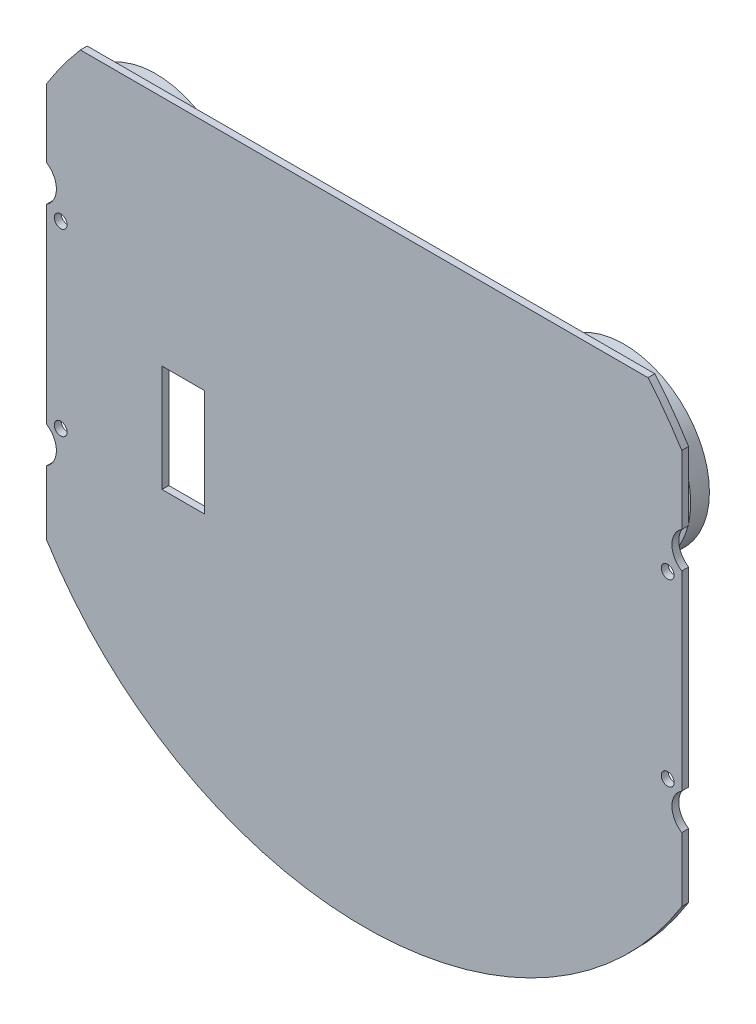
ISO-10303-21;
HEADER;
FILE_DESCRIPTION(('STEP AP214'),'2;1');
FILE_NAME('part.step','',(''),(''),'','','');
FILE_SCHEMA(('AUTOMOTIVE_DESIGN { 1 0 10303 214 1 1 1 1 }'));
ENDSEC;
DATA;
#1=APPLICATION_CONTEXT('core data for automotive mechanical design processes');
#2=APPLICATION_PROTOCOL_DEFINITION('international standard','automotive_design',2000,#1);
#3=PRODUCT_CONTEXT('',#1,'mechanical');
#4=PRODUCT('Part','Part','',(#3));
#5=PRODUCT_RELATED_PRODUCT_CATEGORY('part','',(#4));
#6=PRODUCT_DEFINITION_FORMATION('','',#4);
#7=PRODUCT_DEFINITION_CONTEXT('part definition',#1,'design');
#8=PRODUCT_DEFINITION('design','',#6,#7);
#9=PRODUCT_DEFINITION_SHAPE('','',#8);
#10=(LENGTH_UNIT() NAMED_UNIT(*) SI_UNIT(.MILLI.,.METRE.));
#11=(NAMED_UNIT(*) PLANE_ANGLE_UNIT() SI_UNIT($,.RADIAN.));
#12=(NAMED_UNIT(*) SI_UNIT($,.STERADIAN.) SOLID_ANGLE_UNIT());
#13=UNCERTAINTY_MEASURE_WITH_UNIT(LENGTH_MEASURE(1.E-05),#10,'distance_accuracy_value','');
#14=(GEOMETRIC_REPRESENTATION_CONTEXT(3) GLOBAL_UNCERTAINTY_ASSIGNED_CONTEXT((#13)) GLOBAL_UNIT_ASSIGNED_CONTEXT((#10,
#11,#12)) REPRESENTATION_CONTEXT('',''));
#15=CARTESIAN_POINT('',(0.,0.,0.));
#16=DIRECTION('',(0.,0.,1.));
#17=DIRECTION('',(1.,0.,0.));
#18=AXIS2_PLACEMENT_3D('',#15,#16,#17);
#19=CARTESIAN_POINT('',(-74.3,-100.,10.));
#20=DIRECTION('',(-1.,0.,0.));
#21=DIRECTION('',(0.,0.,1.));
#22=AXIS2_PLACEMENT_3D('',#19,#20,#21);
#23=PLANE('',#22);
#24=DIRECTION('',(0.,0.,-1.));
#25=VECTOR('',#24,1.);
#26=CARTESIAN_POINT('',(-74.3,-22.7916749174998,10.));
#27=LINE('',#26,#25);
#28=CARTESIAN_POINT('',(-74.3,-22.7916749174998,1.6));
#29=VERTEX_POINT('',#28);
#30=CARTESIAN_POINT('',(-74.3,-22.7916749174998,0.));
#31=VERTEX_POINT('',#30);
#32=EDGE_CURVE('E343',#29,#31,#27,.T.);
#33=ORIENTED_EDGE('',*,*,#32,.F.);
#34=DIRECTION('',(0.,-1.,0.));
#35=VECTOR('',#34,1.);
#36=CARTESIAN_POINT('',(-74.3,0.,1.6));
#37=LINE('',#36,#35);
#38=CARTESIAN_POINT('',(-74.3,21.7916749174998,1.6));
#39=VERTEX_POINT('',#38);
#40=EDGE_CURVE('E258',#39,#29,#37,.T.);
#41=ORIENTED_EDGE('',*,*,#40,.F.);
#42=DIRECTION('',(0.,0.,-1.));
#43=VECTOR('',#42,1.);
#44=CARTESIAN_POINT('',(-74.3,21.7916749174998,10.));
#45=LINE('',#44,#43);
#46=CARTESIAN_POINT('',(-74.3,21.7916749174999,0.));
#47=VERTEX_POINT('',#46);
#48=EDGE_CURVE('E337',#47,#39,#45,.F.);
#49=ORIENTED_EDGE('',*,*,#48,.F.);
#50=DIRECTION('',(0.,1.,0.));
#51=VECTOR('',#50,1.);
#52=CARTESIAN_POINT('',(-74.3,-100.,0.));
#53=LINE('',#52,#51);
#54=EDGE_CURVE('E252',#31,#47,#53,.T.);
#55=ORIENTED_EDGE('',*,*,#54,.F.);
#56=EDGE_LOOP('',(#33,#41,#49,#55));
#57=FACE_BOUND('',#56,.T.);
#58=ADVANCED_FACE('F38',(#57),#23,.T.);
#59=CARTESIAN_POINT('',(0.,0.,0.));
#60=DIRECTION('',(0.,0.,1.));
#61=DIRECTION('',(1.,0.,0.));
#62=AXIS2_PLACEMENT_3D('',#59,#60,#61);
#63=PLANE('',#62);
#64=CARTESIAN_POINT('',(-54.772,35.,0.));
#65=DIRECTION('',(0.,0.,1.));
#66=DIRECTION('',(1.,0.,0.));
#67=AXIS2_PLACEMENT_3D('',#64,#65,#66);
#68=CIRCLE('',#67,20.);
#69=CARTESIAN_POINT('',(-74.3,30.6806000416723,0.));
#70=VERTEX_POINT('',#69);
#71=CARTESIAN_POINT('',(-74.1675995107123,30.1203771026792,0.));
#72=VERTEX_POINT('',#71);
#73=EDGE_CURVE('E298',#70,#72,#68,.T.);
#74=ORIENTED_EDGE('',*,*,#73,.T.);
#75=CARTESIAN_POINT('',(-77.,26.,0.));
#76=DIRECTION('',(0.,0.,-1.));
#77=DIRECTION('',(-1.,0.,0.));
#78=AXIS2_PLACEMENT_3D('',#75,#76,#77);
#79=CIRCLE('',#78,5.);
#80=CARTESIAN_POINT('',(-74.3,30.2083250825002,0.));
#81=VERTEX_POINT('',#80);
#82=EDGE_CURVE('E220',#81,#72,#79,.T.);
#83=ORIENTED_EDGE('',*,*,#82,.F.);
#84=EDGE_CURVE('E409',#81,#70,#53,.T.);
#85=ORIENTED_EDGE('',*,*,#84,.T.);
#86=EDGE_LOOP('',(#74,#83,#85));
#87=FACE_BOUND('',#86,.T.);
#88=ADVANCED_FACE('F368',(#87),#63,.F.);
#89=DIRECTION('',(0.,0.,-1.));
#90=VECTOR('',#89,1.);
#91=CARTESIAN_POINT('',(-74.3,30.2083250825002,10.));
#92=LINE('',#91,#90);
#93=CARTESIAN_POINT('',(-74.3,30.2083250825002,1.6));
#94=VERTEX_POINT('',#93);
#95=EDGE_CURVE('E339',#94,#81,#92,.T.);
#96=ORIENTED_EDGE('',*,*,#95,.F.);
#97=CARTESIAN_POINT('',(-74.3,46.2142835062928,1.6));
#98=VERTEX_POINT('',#97);
#99=EDGE_CURVE('E254',#98,#94,#37,.T.);
#100=ORIENTED_EDGE('',*,*,#99,.F.);
#101=DIRECTION('',(0.,0.,-1.));
#102=VECTOR('',#101,1.);
#103=CARTESIAN_POINT('',(-74.3,46.2142835062928,1.6));
#104=LINE('',#103,#102);
#105=CARTESIAN_POINT('',(-74.3,46.2142835062928,0.));
#106=VERTEX_POINT('',#105);
#107=EDGE_CURVE('E321',#98,#106,#104,.T.);
#108=ORIENTED_EDGE('',*,*,#107,.T.);
#109=CARTESIAN_POINT('',(-74.3,39.3193999583277,0.));
#110=VERTEX_POINT('',#109);
#111=EDGE_CURVE('E248',#110,#106,#53,.T.);
#112=ORIENTED_EDGE('',*,*,#111,.F.);
#113=EDGE_CURVE('E251',#70,#110,#53,.T.);
#114=ORIENTED_EDGE('',*,*,#113,.F.);
#115=ORIENTED_EDGE('',*,*,#84,.F.);
#116=EDGE_LOOP('',(#96,#100,#108,#112,#114,#115));
#117=FACE_BOUND('',#116,.T.);
#118=ADVANCED_FACE('F371',(#117),#23,.T.);
#119=DIRECTION('',(0.,-1.,0.));
#120=VECTOR('',#119,1.);
#121=CARTESIAN_POINT('',(74.3,-100.,0.));
#122=LINE('',#121,#120);
#123=CARTESIAN_POINT('',(74.3,30.6806000416725,0.));
#124=VERTEX_POINT('',#123);
#125=CARTESIAN_POINT('',(74.3,30.2083250825002,0.));
#126=VERTEX_POINT('',#125);
#127=EDGE_CURVE('E242',#124,#126,#122,.T.);
#128=ORIENTED_EDGE('',*,*,#127,.T.);
#129=CARTESIAN_POINT('',(77.,26.,0.));
#130=DIRECTION('',(0.,0.,-1.));
#131=DIRECTION('',(-1.,0.,0.));
#132=AXIS2_PLACEMENT_3D('',#129,#130,#131);
#133=CIRCLE('',#132,5.);
#134=CARTESIAN_POINT('',(74.1675995107123,30.1203771026792,0.));
#135=VERTEX_POINT('',#134);
#136=EDGE_CURVE('E229',#135,#126,#133,.T.);
#137=ORIENTED_EDGE('',*,*,#136,.F.);
#138=CARTESIAN_POINT('',(54.772,35.,0.));
#139=DIRECTION('',(0.,0.,1.));
#140=DIRECTION('',(1.,0.,0.));
#141=AXIS2_PLACEMENT_3D('',#138,#139,#140);
#142=CIRCLE('',#141,20.);
#143=EDGE_CURVE('E284',#135,#124,#142,.T.);
#144=ORIENTED_EDGE('',*,*,#143,.T.);
#145=EDGE_LOOP('',(#128,#137,#144));
#146=FACE_BOUND('',#145,.T.);
#147=ADVANCED_FACE('F378',(#146),#63,.F.);
#148=CARTESIAN_POINT('',(74.3,-100.,10.));
#149=DIRECTION('',(1.,0.,0.));
#150=DIRECTION('',(0.,0.,-1.));
#151=AXIS2_PLACEMENT_3D('',#148,#149,#150);
#152=PLANE('',#151);
#153=DIRECTION('',(0.,0.,-1.));
#154=VECTOR('',#153,1.);
#155=CARTESIAN_POINT('',(74.3,21.7916749174998,10.));
#156=LINE('',#155,#154);
#157=CARTESIAN_POINT('',(74.3,21.7916749174998,1.6));
#158=VERTEX_POINT('',#157);
#159=CARTESIAN_POINT('',(74.3,21.7916749174998,0.));
#160=VERTEX_POINT('',#159);
#161=EDGE_CURVE('E335',#158,#160,#156,.T.);
#162=ORIENTED_EDGE('',*,*,#161,.F.);
#163=DIRECTION('',(0.,1.,0.));
#164=VECTOR('',#163,1.);
#165=CARTESIAN_POINT('',(74.3,0.,1.6));
#166=LINE('',#165,#164);
#167=CARTESIAN_POINT('',(74.3,-22.7916749174998,1.6));
#168=VERTEX_POINT('',#167);
#169=EDGE_CURVE('E264',#168,#158,#166,.T.);
#170=ORIENTED_EDGE('',*,*,#169,.F.);
#171=DIRECTION('',(0.,0.,-1.));
#172=VECTOR('',#171,1.);
#173=CARTESIAN_POINT('',(74.3,-22.7916749174998,10.));
#174=LINE('',#173,#172);
#175=CARTESIAN_POINT('',(74.3,-22.7916749174998,0.));
#176=VERTEX_POINT('',#175);
#177=EDGE_CURVE('E329',#176,#168,#174,.F.);
#178=ORIENTED_EDGE('',*,*,#177,.F.);
#179=EDGE_CURVE('E246',#160,#176,#122,.T.);
#180=ORIENTED_EDGE('',*,*,#179,.F.);
#181=EDGE_LOOP('',(#162,#170,#178,#180));
#182=FACE_BOUND('',#181,.T.);
#183=ADVANCED_FACE('F397',(#182),#152,.T.);
#184=DIRECTION('',(0.,0.,-1.));
#185=VECTOR('',#184,1.);
#186=CARTESIAN_POINT('',(74.3,-31.2083250825001,10.));
#187=LINE('',#186,#185);
#188=CARTESIAN_POINT('',(74.3,-31.2083250825001,1.6));
#189=VERTEX_POINT('',#188);
#190=CARTESIAN_POINT('',(74.3,-31.2083250825001,0.));
#191=VERTEX_POINT('',#190);
#192=EDGE_CURVE('E331',#189,#191,#187,.T.);
#193=ORIENTED_EDGE('',*,*,#192,.F.);
#194=CARTESIAN_POINT('',(74.3,-46.2142835062927,1.6));
#195=VERTEX_POINT('',#194);
#196=EDGE_CURVE('E260',#195,#189,#166,.T.);
#197=ORIENTED_EDGE('',*,*,#196,.F.);
#198=DIRECTION('',(0.,0.,-1.));
#199=VECTOR('',#198,1.);
#200=CARTESIAN_POINT('',(74.3,-46.2142835062927,1.6));
#201=LINE('',#200,#199);
#202=CARTESIAN_POINT('',(74.3,-46.2142835062927,0.));
#203=VERTEX_POINT('',#202);
#204=EDGE_CURVE('E326',#195,#203,#201,.T.);
#205=ORIENTED_EDGE('',*,*,#204,.T.);
#206=EDGE_CURVE('E241',#191,#203,#122,.T.);
#207=ORIENTED_EDGE('',*,*,#206,.F.);
#208=EDGE_LOOP('',(#193,#197,#205,#207));
#209=FACE_BOUND('',#208,.T.);
#210=ADVANCED_FACE('F398',(#209),#152,.T.);
#211=CARTESIAN_POINT('',(0.,0.,1.6));
#212=DIRECTION('',(0.,0.,1.));
#213=DIRECTION('',(1.,0.,0.));
#214=AXIS2_PLACEMENT_3D('',#211,#212,#213);
#215=PLANE('',#214);
#216=CARTESIAN_POINT('',(-71.,-22.,1.6));
#217=DIRECTION('',(0.,0.,-1.));
#218=DIRECTION('',(-1.,0.,0.));
#219=AXIS2_PLACEMENT_3D('',#216,#217,#218);
#220=CIRCLE('',#219,1.5);
#221=CARTESIAN_POINT('',(-72.5,-22.,1.6));
#222=VERTEX_POINT('',#221);
#223=EDGE_CURVE('E754',#222,#222,#220,.T.);
#224=ORIENTED_EDGE('',*,*,#223,.T.);
#225=EDGE_LOOP('',(#224));
#226=FACE_BOUND('',#225,.T.);
#227=CARTESIAN_POINT('',(-71.,20.,1.6));
#228=DIRECTION('',(0.,0.,-1.));
#229=DIRECTION('',(-1.,0.,0.));
#230=AXIS2_PLACEMENT_3D('',#227,#228,#229);
#231=CIRCLE('',#230,1.5);
#232=CARTESIAN_POINT('',(-72.5,20.,1.6));
#233=VERTEX_POINT('',#232);
#234=EDGE_CURVE('E762',#233,#233,#231,.T.);
#235=ORIENTED_EDGE('',*,*,#234,.T.);
#236=EDGE_LOOP('',(#235));
#237=FACE_BOUND('',#236,.T.);
#238=CARTESIAN_POINT('',(71.,-22.,1.6));
#239=DIRECTION('',(0.,0.,-1.));
#240=DIRECTION('',(-1.,0.,0.));
#241=AXIS2_PLACEMENT_3D('',#238,#239,#240);
#242=CIRCLE('',#241,1.5);
#243=CARTESIAN_POINT('',(69.5,-22.,1.6));
#244=VERTEX_POINT('',#243);
#245=EDGE_CURVE('E768',#244,#244,#242,.T.);
#246=ORIENTED_EDGE('',*,*,#245,.T.);
#247=EDGE_LOOP('',(#246));
#248=FACE_BOUND('',#247,.T.);
#249=CARTESIAN_POINT('',(71.,20.,1.6));
#250=DIRECTION('',(0.,0.,-1.));
#251=DIRECTION('',(-1.,0.,0.));
#252=AXIS2_PLACEMENT_3D('',#249,#250,#251);
#253=CIRCLE('',#252,1.5);
#254=CARTESIAN_POINT('',(69.5,20.,1.6));
#255=VERTEX_POINT('',#254);
#256=EDGE_CURVE('E774',#255,#255,#253,.T.);
#257=ORIENTED_EDGE('',*,*,#256,.T.);
#258=EDGE_LOOP('',(#257));
#259=FACE_BOUND('',#258,.T.);
#260=DIRECTION('',(0.,1.,0.));
#261=VECTOR('',#260,1.);
#262=CARTESIAN_POINT('',(-37.3,-22.5,1.6));
#263=LINE('',#262,#261);
#264=CARTESIAN_POINT('',(-37.3,-22.5,1.6));
#265=VERTEX_POINT('',#264);
#266=CARTESIAN_POINT('',(-37.3,2.50000000000001,1.6));
#267=VERTEX_POINT('',#266);
#268=EDGE_CURVE('E53',#265,#267,#263,.T.);
#269=ORIENTED_EDGE('',*,*,#268,.F.);
#270=DIRECTION('',(1.,0.,0.));
#271=VECTOR('',#270,1.);
#272=CARTESIAN_POINT('',(-47.3,-22.5,1.6));
#273=LINE('',#272,#271);
#274=CARTESIAN_POINT('',(-47.3,-22.5,1.6));
#275=VERTEX_POINT('',#274);
#276=EDGE_CURVE('E206',#275,#265,#273,.T.);
#277=ORIENTED_EDGE('',*,*,#276,.F.);
#278=DIRECTION('',(0.,-1.,0.));
#279=VECTOR('',#278,1.);
#280=CARTESIAN_POINT('',(-47.3,-22.5,1.6));
#281=LINE('',#280,#279);
#282=CARTESIAN_POINT('',(-47.3,2.50000000000001,1.6));
#283=VERTEX_POINT('',#282);
#284=EDGE_CURVE('E190',#283,#275,#281,.T.);
#285=ORIENTED_EDGE('',*,*,#284,.F.);
#286=DIRECTION('',(-1.,0.,0.));
#287=VECTOR('',#286,1.);
#288=CARTESIAN_POINT('',(-47.3,2.50000000000001,1.6));
#289=LINE('',#288,#287);
#290=EDGE_CURVE('E199',#267,#283,#289,.T.);
#291=ORIENTED_EDGE('',*,*,#290,.F.);
#292=EDGE_LOOP('',(#269,#277,#285,#291));
#293=FACE_BOUND('',#292,.T.);
#294=CARTESIAN_POINT('',(-77.,-27.,1.6));
#295=DIRECTION('',(0.,0.,1.));
#296=DIRECTION('',(1.,0.,0.));
#297=AXIS2_PLACEMENT_3D('',#294,#295,#296);
#298=CIRCLE('',#297,5.);
#299=CARTESIAN_POINT('',(-74.3,-31.2083250825002,1.6));
#300=VERTEX_POINT('',#299);
#301=EDGE_CURVE('E217',#300,#29,#298,.T.);
#302=ORIENTED_EDGE('',*,*,#301,.F.);
#303=CARTESIAN_POINT('',(-74.3,-46.2142835062928,1.6));
#304=VERTEX_POINT('',#303);
#305=EDGE_CURVE('E259',#300,#304,#37,.T.);
#306=ORIENTED_EDGE('',*,*,#305,.T.);
#307=CARTESIAN_POINT('',(0.,0.,1.6));
#308=DIRECTION('',(0.,0.,1.));
#309=DIRECTION('',(1.,0.,0.));
#310=AXIS2_PLACEMENT_3D('',#307,#308,#309);
#311=CIRCLE('',#310,87.5);
#312=EDGE_CURVE('E303',#304,#195,#311,.T.);
#313=ORIENTED_EDGE('',*,*,#312,.T.);
#314=ORIENTED_EDGE('',*,*,#196,.T.);
#315=CARTESIAN_POINT('',(77.,-27.,1.6));
#316=DIRECTION('',(0.,0.,1.));
#317=DIRECTION('',(1.,0.,0.));
#318=AXIS2_PLACEMENT_3D('',#315,#316,#317);
#319=CIRCLE('',#318,5.);
#320=EDGE_CURVE('E239',#168,#189,#319,.T.);
#321=ORIENTED_EDGE('',*,*,#320,.F.);
#322=ORIENTED_EDGE('',*,*,#169,.T.);
#323=CARTESIAN_POINT('',(77.,26.,1.6));
#324=DIRECTION('',(0.,0.,1.));
#325=DIRECTION('',(1.,0.,0.));
#326=AXIS2_PLACEMENT_3D('',#323,#324,#325);
#327=CIRCLE('',#326,5.);
#328=CARTESIAN_POINT('',(74.3,30.2083250825002,1.6));
#329=VERTEX_POINT('',#328);
#330=EDGE_CURVE('E234',#329,#158,#327,.T.);
#331=ORIENTED_EDGE('',*,*,#330,.F.);
#332=CARTESIAN_POINT('',(74.3,46.2142835062927,1.6));
#333=VERTEX_POINT('',#332);
#334=EDGE_CURVE('E257',#329,#333,#166,.T.);
#335=ORIENTED_EDGE('',*,*,#334,.T.);
#336=CARTESIAN_POINT('',(66.3871222452066,57.,1.6));
#337=VERTEX_POINT('',#336);
#338=EDGE_CURVE('E304',#333,#337,#311,.T.);
#339=ORIENTED_EDGE('',*,*,#338,.T.);
#340=DIRECTION('',(-1.,0.,0.));
#341=VECTOR('',#340,1.);
#342=CARTESIAN_POINT('',(-66.3871222452066,57.,1.6));
#343=LINE('',#342,#341);
#344=CARTESIAN_POINT('',(-66.3871222452066,57.,1.6));
#345=VERTEX_POINT('',#344);
#346=EDGE_CURVE('E302',#337,#345,#343,.T.);
#347=ORIENTED_EDGE('',*,*,#346,.T.);
#348=EDGE_CURVE('E299',#345,#98,#311,.T.);
#349=ORIENTED_EDGE('',*,*,#348,.T.);
#350=ORIENTED_EDGE('',*,*,#99,.T.);
#351=CARTESIAN_POINT('',(-77.,26.,1.6));
#352=DIRECTION('',(0.,0.,1.));
#353=DIRECTION('',(1.,0.,0.));
#354=AXIS2_PLACEMENT_3D('',#351,#352,#353);
#355=CIRCLE('',#354,5.);
#356=EDGE_CURVE('E226',#39,#94,#355,.T.);
#357=ORIENTED_EDGE('',*,*,#356,.F.);
#358=ORIENTED_EDGE('',*,*,#40,.T.);
#359=EDGE_LOOP('',(#302,#306,#313,#314,#321,#322,#331,#335,#339,#347,#349,#350,#357,#358));
#360=FACE_BOUND('',#359,.T.);
#361=ADVANCED_FACE('F203',(#226,#237,#248,#259,#293,#360),#215,.T.);
#362=CARTESIAN_POINT('',(-71.,-22.,0.));
#363=DIRECTION('',(0.,0.,-1.));
#364=DIRECTION('',(-1.,0.,0.));
#365=AXIS2_PLACEMENT_3D('',#362,#363,#364);
#366=CIRCLE('',#365,1.5);
#367=CARTESIAN_POINT('',(-72.5,-22.,0.));
#368=VERTEX_POINT('',#367);
#369=EDGE_CURVE('E757',#368,#368,#366,.T.);
#370=ORIENTED_EDGE('',*,*,#369,.F.);
#371=EDGE_LOOP('',(#370));
#372=FACE_BOUND('',#371,.T.);
#373=CARTESIAN_POINT('',(-71.,20.,0.));
#374=DIRECTION('',(0.,0.,-1.));
#375=DIRECTION('',(-1.,0.,0.));
#376=AXIS2_PLACEMENT_3D('',#373,#374,#375);
#377=CIRCLE('',#376,1.5);
#378=CARTESIAN_POINT('',(-72.5,20.,0.));
#379=VERTEX_POINT('',#378);
#380=EDGE_CURVE('E759',#379,#379,#377,.T.);
#381=ORIENTED_EDGE('',*,*,#380,.F.);
#382=EDGE_LOOP('',(#381));
#383=FACE_BOUND('',#382,.T.);
#384=CARTESIAN_POINT('',(71.,-22.,0.));
#385=DIRECTION('',(0.,0.,-1.));
#386=DIRECTION('',(-1.,0.,0.));
#387=AXIS2_PLACEMENT_3D('',#384,#385,#386);
#388=CIRCLE('',#387,1.5);
#389=CARTESIAN_POINT('',(69.5,-22.,0.));
#390=VERTEX_POINT('',#389);
#391=EDGE_CURVE('E765',#390,#390,#388,.T.);
#392=ORIENTED_EDGE('',*,*,#391,.F.);
#393=EDGE_LOOP('',(#392));
#394=FACE_BOUND('',#393,.T.);
#395=CARTESIAN_POINT('',(71.,20.,0.));
#396=DIRECTION('',(0.,0.,-1.));
#397=DIRECTION('',(-1.,0.,0.));
#398=AXIS2_PLACEMENT_3D('',#395,#396,#397);
#399=CIRCLE('',#398,1.5);
#400=CARTESIAN_POINT('',(69.5,20.,0.));
#401=VERTEX_POINT('',#400);
#402=EDGE_CURVE('E771',#401,#401,#399,.T.);
#403=ORIENTED_EDGE('',*,*,#402,.F.);
#404=EDGE_LOOP('',(#403));
#405=FACE_BOUND('',#404,.T.);
#406=DIRECTION('',(1.,0.,0.));
#407=VECTOR('',#406,1.);
#408=CARTESIAN_POINT('',(0.,-22.5,0.));
#409=LINE('',#408,#407);
#410=CARTESIAN_POINT('',(-47.3,-22.5,0.));
#411=VERTEX_POINT('',#410);
#412=CARTESIAN_POINT('',(-37.3,-22.5,0.));
#413=VERTEX_POINT('',#412);
#414=EDGE_CURVE('E46',#411,#413,#409,.T.);
#415=ORIENTED_EDGE('',*,*,#414,.T.);
#416=DIRECTION('',(0.,1.,0.));
#417=VECTOR('',#416,1.);
#418=CARTESIAN_POINT('',(-37.3,0.,0.));
#419=LINE('',#418,#417);
#420=CARTESIAN_POINT('',(-37.3,2.50000000000001,0.));
#421=VERTEX_POINT('',#420);
#422=EDGE_CURVE('E12',#413,#421,#419,.T.);
#423=ORIENTED_EDGE('',*,*,#422,.T.);
#424=DIRECTION('',(-1.,0.,0.));
#425=VECTOR('',#424,1.);
#426=CARTESIAN_POINT('',(0.,2.50000000000001,0.));
#427=LINE('',#426,#425);
#428=CARTESIAN_POINT('',(-47.3,2.50000000000001,0.));
#429=VERTEX_POINT('',#428);
#430=EDGE_CURVE('E345',#421,#429,#427,.T.);
#431=ORIENTED_EDGE('',*,*,#430,.T.);
#432=DIRECTION('',(0.,-1.,0.));
#433=VECTOR('',#432,1.);
#434=CARTESIAN_POINT('',(-47.3,0.,0.));
#435=LINE('',#434,#433);
#436=EDGE_CURVE('E193',#429,#411,#435,.T.);
#437=ORIENTED_EDGE('',*,*,#436,.T.);
#438=EDGE_LOOP('',(#415,#423,#431,#437));
#439=FACE_BOUND('',#438,.T.);
#440=CARTESIAN_POINT('',(35.,-54.772,0.));
#441=DIRECTION('',(0.,0.,1.));
#442=DIRECTION('',(1.,0.,0.));
#443=AXIS2_PLACEMENT_3D('',#440,#441,#442);
#444=CIRCLE('',#443,20.);
#445=CARTESIAN_POINT('',(55.,-54.772,0.));
#446=VERTEX_POINT('',#445);
#447=EDGE_CURVE('E267',#446,#446,#444,.T.);
#448=ORIENTED_EDGE('',*,*,#447,.T.);
#449=EDGE_LOOP('',(#448));
#450=FACE_BOUND('',#449,.T.);
#451=CARTESIAN_POINT('',(0.,0.,0.));
#452=DIRECTION('',(0.,0.,1.));
#453=DIRECTION('',(1.,0.,0.));
#454=AXIS2_PLACEMENT_3D('',#451,#452,#453);
#455=CIRCLE('',#454,25.);
#456=CARTESIAN_POINT('',(25.,0.,0.));
#457=VERTEX_POINT('',#456);
#458=EDGE_CURVE('E287',#457,#457,#455,.T.);
#459=ORIENTED_EDGE('',*,*,#458,.T.);
#460=EDGE_LOOP('',(#459));
#461=FACE_BOUND('',#460,.T.);
#462=CARTESIAN_POINT('',(-35.,-54.772,0.));
#463=DIRECTION('',(0.,0.,1.));
#464=DIRECTION('',(1.,0.,0.));
#465=AXIS2_PLACEMENT_3D('',#462,#463,#464);
#466=CIRCLE('',#465,20.);
#467=CARTESIAN_POINT('',(-15.,-54.772,0.));
#468=VERTEX_POINT('',#467);
#469=EDGE_CURVE('E273',#468,#468,#466,.T.);
#470=ORIENTED_EDGE('',*,*,#469,.T.);
#471=EDGE_LOOP('',(#470));
#472=FACE_BOUND('',#471,.T.);
#473=CARTESIAN_POINT('',(-74.3,-46.2142835062928,0.));
#474=VERTEX_POINT('',#473);
#475=CARTESIAN_POINT('',(-74.3,-31.2083250825002,0.));
#476=VERTEX_POINT('',#475);
#477=EDGE_CURVE('E253',#474,#476,#53,.T.);
#478=ORIENTED_EDGE('',*,*,#477,.T.);
#479=CARTESIAN_POINT('',(-77.,-27.,0.));
#480=DIRECTION('',(0.,0.,-1.));
#481=DIRECTION('',(-1.,0.,0.));
#482=AXIS2_PLACEMENT_3D('',#479,#480,#481);
#483=CIRCLE('',#482,5.);
#484=EDGE_CURVE('E213',#31,#476,#483,.T.);
#485=ORIENTED_EDGE('',*,*,#484,.F.);
#486=ORIENTED_EDGE('',*,*,#54,.T.);
#487=CARTESIAN_POINT('',(-72.0988051882717,25.0109148583225,0.));
#488=VERTEX_POINT('',#487);
#489=EDGE_CURVE('E219',#488,#47,#79,.T.);
#490=ORIENTED_EDGE('',*,*,#489,.F.);
#491=EDGE_CURVE('E293',#488,#110,#68,.T.);
#492=ORIENTED_EDGE('',*,*,#491,.T.);
#493=ORIENTED_EDGE('',*,*,#111,.T.);
#494=CARTESIAN_POINT('',(0.,0.,0.));
#495=DIRECTION('',(0.,0.,1.));
#496=DIRECTION('',(1.,0.,0.));
#497=AXIS2_PLACEMENT_3D('',#494,#495,#496);
#498=CIRCLE('',#497,87.5);
#499=CARTESIAN_POINT('',(-66.3871222452066,57.,0.));
#500=VERTEX_POINT('',#499);
#501=EDGE_CURVE('E307',#500,#106,#498,.T.);
#502=ORIENTED_EDGE('',*,*,#501,.F.);
#503=DIRECTION('',(-1.,0.,0.));
#504=VECTOR('',#503,1.);
#505=CARTESIAN_POINT('',(-66.3871222452066,57.,0.));
#506=LINE('',#505,#504);
#507=CARTESIAN_POINT('',(66.3871222452066,57.,0.));
#508=VERTEX_POINT('',#507);
#509=EDGE_CURVE('E310',#508,#500,#506,.T.);
#510=ORIENTED_EDGE('',*,*,#509,.F.);
#511=CARTESIAN_POINT('',(74.3,46.2142835062927,0.));
#512=VERTEX_POINT('',#511);
#513=EDGE_CURVE('E297',#512,#508,#498,.T.);
#514=ORIENTED_EDGE('',*,*,#513,.F.);
#515=CARTESIAN_POINT('',(74.3,39.3193999583275,0.));
#516=VERTEX_POINT('',#515);
#517=EDGE_CURVE('E247',#512,#516,#122,.T.);
#518=ORIENTED_EDGE('',*,*,#517,.T.);
#519=CARTESIAN_POINT('',(72.0988051882717,25.0109148583225,0.));
#520=VERTEX_POINT('',#519);
#521=EDGE_CURVE('E280',#516,#520,#142,.T.);
#522=ORIENTED_EDGE('',*,*,#521,.T.);
#523=EDGE_CURVE('E232',#160,#520,#133,.T.);
#524=ORIENTED_EDGE('',*,*,#523,.F.);
#525=ORIENTED_EDGE('',*,*,#179,.T.);
#526=CARTESIAN_POINT('',(77.,-27.,0.));
#527=DIRECTION('',(0.,0.,-1.));
#528=DIRECTION('',(-1.,0.,0.));
#529=AXIS2_PLACEMENT_3D('',#526,#527,#528);
#530=CIRCLE('',#529,5.);
#531=EDGE_CURVE('E236',#191,#176,#530,.T.);
#532=ORIENTED_EDGE('',*,*,#531,.F.);
#533=ORIENTED_EDGE('',*,*,#206,.T.);
#534=EDGE_CURVE('E311',#474,#203,#498,.T.);
#535=ORIENTED_EDGE('',*,*,#534,.F.);
#536=EDGE_LOOP('',(#478,#485,#486,#490,#492,#493,#502,#510,#514,#518,#522,#524,#525,#532,#533,#535));
#537=FACE_BOUND('',#536,.T.);
#538=ADVANCED_FACE('F349',(#372,#383,#394,#405,#439,#450,#461,#472,#537),#63,.F.);
#539=CARTESIAN_POINT('',(0.,0.,1.6));
#540=DIRECTION('',(0.,0.,-1.));
#541=DIRECTION('',(-1.,0.,0.));
#542=AXIS2_PLACEMENT_3D('',#539,#540,#541);
#543=CYLINDRICAL_SURFACE('',#542,87.5);
#544=ORIENTED_EDGE('',*,*,#204,.F.);
#545=ORIENTED_EDGE('',*,*,#312,.F.);
#546=DIRECTION('',(0.,0.,-1.));
#547=VECTOR('',#546,1.);
#548=CARTESIAN_POINT('',(-74.3,-46.2142835062928,1.6));
#549=LINE('',#548,#547);
#550=EDGE_CURVE('E318',#474,#304,#549,.F.);
#551=ORIENTED_EDGE('',*,*,#550,.F.);
#552=ORIENTED_EDGE('',*,*,#534,.T.);
#553=EDGE_LOOP('',(#544,#545,#551,#552));
#554=FACE_BOUND('',#553,.T.);
#555=ADVANCED_FACE('F40',(#554),#543,.T.);
#556=DIRECTION('',(0.,0.,-1.));
#557=VECTOR('',#556,1.);
#558=CARTESIAN_POINT('',(74.3,46.2142835062927,1.6));
#559=LINE('',#558,#557);
#560=EDGE_CURVE('E323',#512,#333,#559,.F.);
#561=ORIENTED_EDGE('',*,*,#560,.F.);
#562=ORIENTED_EDGE('',*,*,#513,.T.);
#563=DIRECTION('',(0.,0.,-1.));
#564=VECTOR('',#563,1.);
#565=CARTESIAN_POINT('',(66.3871222452066,57.,1.6));
#566=LINE('',#565,#564);
#567=EDGE_CURVE('E315',#337,#508,#566,.T.);
#568=ORIENTED_EDGE('',*,*,#567,.F.);
#569=ORIENTED_EDGE('',*,*,#338,.F.);
#570=EDGE_LOOP('',(#561,#562,#568,#569));
#571=FACE_BOUND('',#570,.T.);
#572=ADVANCED_FACE('F539',(#571),#543,.T.);
#573=ORIENTED_EDGE('',*,*,#107,.F.);
#574=ORIENTED_EDGE('',*,*,#348,.F.);
#575=DIRECTION('',(0.,0.,-1.));
#576=VECTOR('',#575,1.);
#577=CARTESIAN_POINT('',(-66.3871222452066,57.,1.6));
#578=LINE('',#577,#576);
#579=EDGE_CURVE('E306',#345,#500,#578,.T.);
#580=ORIENTED_EDGE('',*,*,#579,.T.);
#581=ORIENTED_EDGE('',*,*,#501,.T.);
#582=EDGE_LOOP('',(#573,#574,#580,#581));
#583=FACE_BOUND('',#582,.T.);
#584=ADVANCED_FACE('F534',(#583),#543,.T.);
#585=CARTESIAN_POINT('',(-66.3871222452066,57.,1.6));
#586=DIRECTION('',(0.,-1.,0.));
#587=DIRECTION('',(0.,0.,-1.));
#588=AXIS2_PLACEMENT_3D('',#585,#586,#587);
#589=PLANE('',#588);
#590=ORIENTED_EDGE('',*,*,#509,.T.);
#591=ORIENTED_EDGE('',*,*,#579,.F.);
#592=ORIENTED_EDGE('',*,*,#346,.F.);
#593=ORIENTED_EDGE('',*,*,#567,.T.);
#594=EDGE_LOOP('',(#590,#591,#592,#593));
#595=FACE_BOUND('',#594,.T.);
#596=ADVANCED_FACE('F527',(#595),#589,.F.);
#597=CARTESIAN_POINT('',(-54.772,35.,-4.4));
#598=DIRECTION('',(0.,0.,1.));
#599=DIRECTION('',(1.,0.,0.));
#600=AXIS2_PLACEMENT_3D('',#597,#598,#599);
#601=CYLINDRICAL_SURFACE('',#600,20.);
#602=CARTESIAN_POINT('',(-54.772,35.,-4.4));
#603=DIRECTION('',(0.,0.,1.));
#604=DIRECTION('',(1.,0.,0.));
#605=AXIS2_PLACEMENT_3D('',#602,#603,#604);
#606=CIRCLE('',#605,20.);
#607=CARTESIAN_POINT('',(-34.772,35.,-4.4));
#608=VERTEX_POINT('',#607);
#609=EDGE_CURVE('E290',#608,#608,#606,.T.);
#610=ORIENTED_EDGE('',*,*,#609,.T.);
#611=EDGE_LOOP('',(#610));
#612=FACE_BOUND('',#611,.T.);
#613=EDGE_CURVE('E294',#110,#70,#68,.T.);
#614=ORIENTED_EDGE('',*,*,#613,.F.);
#615=ORIENTED_EDGE('',*,*,#491,.F.);
#616=CARTESIAN_POINT('',(-54.772,35.,0.));
#617=DIRECTION('',(0.,0.,-1.));
#618=DIRECTION('',(-1.,0.,0.));
#619=AXIS2_PLACEMENT_3D('',#616,#617,#618);
#620=CIRCLE('',#619,20.);
#621=EDGE_CURVE('E223',#72,#488,#620,.F.);
#622=ORIENTED_EDGE('',*,*,#621,.F.);
#623=ORIENTED_EDGE('',*,*,#73,.F.);
#624=EDGE_LOOP('',(#614,#615,#622,#623));
#625=FACE_BOUND('',#624,.T.);
#626=ADVANCED_FACE('F422',(#612,#625),#601,.T.);
#627=CARTESIAN_POINT('',(-54.772,35.,-4.4));
#628=DIRECTION('',(0.,0.,1.));
#629=DIRECTION('',(1.,0.,0.));
#630=AXIS2_PLACEMENT_3D('',#627,#628,#629);
#631=PLANE('',#630);
#632=ORIENTED_EDGE('',*,*,#609,.F.);
#633=EDGE_LOOP('',(#632));
#634=FACE_BOUND('',#633,.T.);
#635=ADVANCED_FACE('F520',(#634),#631,.F.);
#636=CARTESIAN_POINT('',(0.,0.,-4.4));
#637=DIRECTION('',(0.,0.,1.));
#638=DIRECTION('',(1.,0.,0.));
#639=AXIS2_PLACEMENT_3D('',#636,#637,#638);
#640=CYLINDRICAL_SURFACE('',#639,25.);
#641=CARTESIAN_POINT('',(0.,0.,-4.4));
#642=DIRECTION('',(0.,0.,1.));
#643=DIRECTION('',(1.,0.,0.));
#644=AXIS2_PLACEMENT_3D('',#641,#642,#643);
#645=CIRCLE('',#644,25.);
#646=CARTESIAN_POINT('',(25.,0.,-4.4));
#647=VERTEX_POINT('',#646);
#648=EDGE_CURVE('E283',#647,#647,#645,.T.);
#649=ORIENTED_EDGE('',*,*,#648,.T.);
#650=EDGE_LOOP('',(#649));
#651=FACE_BOUND('',#650,.T.);
#652=ORIENTED_EDGE('',*,*,#458,.F.);
#653=EDGE_LOOP('',(#652));
#654=FACE_BOUND('',#653,.T.);
#655=ADVANCED_FACE('F516',(#651,#654),#640,.T.);
#656=CARTESIAN_POINT('',(0.,0.,-4.4));
#657=DIRECTION('',(0.,0.,1.));
#658=DIRECTION('',(1.,0.,0.));
#659=AXIS2_PLACEMENT_3D('',#656,#657,#658);
#660=PLANE('',#659);
#661=ORIENTED_EDGE('',*,*,#648,.F.);
#662=EDGE_LOOP('',(#661));
#663=FACE_BOUND('',#662,.T.);
#664=ADVANCED_FACE('F512',(#663),#660,.F.);
#665=CARTESIAN_POINT('',(54.772,35.,-4.4));
#666=DIRECTION('',(0.,0.,1.));
#667=DIRECTION('',(1.,0.,0.));
#668=AXIS2_PLACEMENT_3D('',#665,#666,#667);
#669=CYLINDRICAL_SURFACE('',#668,20.);
#670=CARTESIAN_POINT('',(54.772,35.,-4.4));
#671=DIRECTION('',(0.,0.,1.));
#672=DIRECTION('',(1.,0.,0.));
#673=AXIS2_PLACEMENT_3D('',#670,#671,#672);
#674=CIRCLE('',#673,20.);
#675=CARTESIAN_POINT('',(74.772,35.,-4.4));
#676=VERTEX_POINT('',#675);
#677=EDGE_CURVE('E276',#676,#676,#674,.T.);
#678=ORIENTED_EDGE('',*,*,#677,.T.);
#679=EDGE_LOOP('',(#678));
#680=FACE_BOUND('',#679,.T.);
#681=ORIENTED_EDGE('',*,*,#521,.F.);
#682=EDGE_CURVE('E279',#124,#516,#142,.T.);
#683=ORIENTED_EDGE('',*,*,#682,.F.);
#684=ORIENTED_EDGE('',*,*,#143,.F.);
#685=CARTESIAN_POINT('',(54.772,35.,0.));
#686=DIRECTION('',(0.,0.,-1.));
#687=DIRECTION('',(-1.,0.,0.));
#688=AXIS2_PLACEMENT_3D('',#685,#686,#687);
#689=CIRCLE('',#688,20.);
#690=EDGE_CURVE('E231',#520,#135,#689,.F.);
#691=ORIENTED_EDGE('',*,*,#690,.F.);
#692=EDGE_LOOP('',(#681,#683,#684,#691));
#693=FACE_BOUND('',#692,.T.);
#694=ADVANCED_FACE('F470',(#680,#693),#669,.T.);
#695=CARTESIAN_POINT('',(54.772,35.,-4.4));
#696=DIRECTION('',(0.,0.,1.));
#697=DIRECTION('',(1.,0.,0.));
#698=AXIS2_PLACEMENT_3D('',#695,#696,#697);
#699=PLANE('',#698);
#700=ORIENTED_EDGE('',*,*,#677,.F.);
#701=EDGE_LOOP('',(#700));
#702=FACE_BOUND('',#701,.T.);
#703=ADVANCED_FACE('F505',(#702),#699,.F.);
#704=CARTESIAN_POINT('',(-35.,-54.772,-4.4));
#705=DIRECTION('',(0.,0.,1.));
#706=DIRECTION('',(1.,0.,0.));
#707=AXIS2_PLACEMENT_3D('',#704,#705,#706);
#708=CYLINDRICAL_SURFACE('',#707,20.);
#709=CARTESIAN_POINT('',(-35.,-54.772,-4.4));
#710=DIRECTION('',(0.,0.,1.));
#711=DIRECTION('',(1.,0.,0.));
#712=AXIS2_PLACEMENT_3D('',#709,#710,#711);
#713=CIRCLE('',#712,20.);
#714=CARTESIAN_POINT('',(-15.,-54.772,-4.4));
#715=VERTEX_POINT('',#714);
#716=EDGE_CURVE('E270',#715,#715,#713,.T.);
#717=ORIENTED_EDGE('',*,*,#716,.T.);
#718=EDGE_LOOP('',(#717));
#719=FACE_BOUND('',#718,.T.);
#720=ORIENTED_EDGE('',*,*,#469,.F.);
#721=EDGE_LOOP('',(#720));
#722=FACE_BOUND('',#721,.T.);
#723=ADVANCED_FACE('F501',(#719,#722),#708,.T.);
#724=CARTESIAN_POINT('',(-35.,-54.772,-4.4));
#725=DIRECTION('',(0.,0.,1.));
#726=DIRECTION('',(1.,0.,0.));
#727=AXIS2_PLACEMENT_3D('',#724,#725,#726);
#728=PLANE('',#727);
#729=ORIENTED_EDGE('',*,*,#716,.F.);
#730=EDGE_LOOP('',(#729));
#731=FACE_BOUND('',#730,.T.);
#732=ADVANCED_FACE('F497',(#731),#728,.F.);
#733=CARTESIAN_POINT('',(35.,-54.772,-4.4));
#734=DIRECTION('',(0.,0.,1.));
#735=DIRECTION('',(1.,0.,0.));
#736=AXIS2_PLACEMENT_3D('',#733,#734,#735);
#737=CYLINDRICAL_SURFACE('',#736,20.);
#738=CARTESIAN_POINT('',(35.,-54.772,-4.4));
#739=DIRECTION('',(0.,0.,1.));
#740=DIRECTION('',(1.,0.,0.));
#741=AXIS2_PLACEMENT_3D('',#738,#739,#740);
#742=CIRCLE('',#741,20.);
#743=CARTESIAN_POINT('',(55.,-54.772,-4.4));
#744=VERTEX_POINT('',#743);
#745=EDGE_CURVE('E263',#744,#744,#742,.T.);
#746=ORIENTED_EDGE('',*,*,#745,.T.);
#747=EDGE_LOOP('',(#746));
#748=FACE_BOUND('',#747,.T.);
#749=ORIENTED_EDGE('',*,*,#447,.F.);
#750=EDGE_LOOP('',(#749));
#751=FACE_BOUND('',#750,.T.);
#752=ADVANCED_FACE('F493',(#748,#751),#737,.T.);
#753=CARTESIAN_POINT('',(35.,-54.772,-4.4));
#754=DIRECTION('',(0.,0.,1.));
#755=DIRECTION('',(1.,0.,0.));
#756=AXIS2_PLACEMENT_3D('',#753,#754,#755);
#757=PLANE('',#756);
#758=ORIENTED_EDGE('',*,*,#745,.F.);
#759=EDGE_LOOP('',(#758));
#760=FACE_BOUND('',#759,.T.);
#761=ADVANCED_FACE('F490',(#760),#757,.F.);
#762=CARTESIAN_POINT('',(0.,0.,0.));
#763=DIRECTION('',(0.,0.,-1.));
#764=DIRECTION('',(-1.,0.,0.));
#765=AXIS2_PLACEMENT_3D('',#762,#763,#764);
#766=PLANE('',#765);
#767=ORIENTED_EDGE('',*,*,#682,.T.);
#768=EDGE_CURVE('E245',#516,#124,#122,.T.);
#769=ORIENTED_EDGE('',*,*,#768,.T.);
#770=EDGE_LOOP('',(#767,#769));
#771=FACE_BOUND('',#770,.T.);
#772=ADVANCED_FACE('F395',(#771),#766,.F.);
#773=DIRECTION('',(0.,0.,-1.));
#774=VECTOR('',#773,1.);
#775=CARTESIAN_POINT('',(74.3,30.2083250825002,10.));
#776=LINE('',#775,#774);
#777=EDGE_CURVE('E333',#126,#329,#776,.F.);
#778=ORIENTED_EDGE('',*,*,#777,.F.);
#779=ORIENTED_EDGE('',*,*,#127,.F.);
#780=ORIENTED_EDGE('',*,*,#768,.F.);
#781=ORIENTED_EDGE('',*,*,#517,.F.);
#782=ORIENTED_EDGE('',*,*,#560,.T.);
#783=ORIENTED_EDGE('',*,*,#334,.F.);
#784=EDGE_LOOP('',(#778,#779,#780,#781,#782,#783));
#785=FACE_BOUND('',#784,.T.);
#786=ADVANCED_FACE('F386',(#785),#152,.T.);
#787=DIRECTION('',(0.,0.,-1.));
#788=VECTOR('',#787,1.);
#789=CARTESIAN_POINT('',(-74.3,-31.2083250825002,10.));
#790=LINE('',#789,#788);
#791=EDGE_CURVE('E341',#476,#300,#790,.F.);
#792=ORIENTED_EDGE('',*,*,#791,.F.);
#793=ORIENTED_EDGE('',*,*,#477,.F.);
#794=ORIENTED_EDGE('',*,*,#550,.T.);
#795=ORIENTED_EDGE('',*,*,#305,.F.);
#796=EDGE_LOOP('',(#792,#793,#794,#795));
#797=FACE_BOUND('',#796,.T.);
#798=ADVANCED_FACE('F372',(#797),#23,.T.);
#799=ORIENTED_EDGE('',*,*,#613,.T.);
#800=ORIENTED_EDGE('',*,*,#113,.T.);
#801=EDGE_LOOP('',(#799,#800));
#802=FACE_BOUND('',#801,.T.);
#803=ADVANCED_FACE('F385',(#802),#766,.F.);
#804=CARTESIAN_POINT('',(77.,-27.,10.));
#805=DIRECTION('',(0.,0.,-1.));
#806=DIRECTION('',(-1.,0.,0.));
#807=AXIS2_PLACEMENT_3D('',#804,#805,#806);
#808=CYLINDRICAL_SURFACE('',#807,5.);
#809=ORIENTED_EDGE('',*,*,#192,.T.);
#810=ORIENTED_EDGE('',*,*,#531,.T.);
#811=ORIENTED_EDGE('',*,*,#177,.T.);
#812=ORIENTED_EDGE('',*,*,#320,.T.);
#813=EDGE_LOOP('',(#809,#810,#811,#812));
#814=FACE_BOUND('',#813,.T.);
#815=ADVANCED_FACE('F392',(#814),#808,.F.);
#816=CARTESIAN_POINT('',(77.,26.,10.));
#817=DIRECTION('',(0.,0.,-1.));
#818=DIRECTION('',(-1.,0.,0.));
#819=AXIS2_PLACEMENT_3D('',#816,#817,#818);
#820=CYLINDRICAL_SURFACE('',#819,5.);
#821=ORIENTED_EDGE('',*,*,#161,.T.);
#822=ORIENTED_EDGE('',*,*,#523,.T.);
#823=EDGE_CURVE('E228',#520,#135,#133,.T.);
#824=ORIENTED_EDGE('',*,*,#823,.T.);
#825=ORIENTED_EDGE('',*,*,#136,.T.);
#826=ORIENTED_EDGE('',*,*,#777,.T.);
#827=ORIENTED_EDGE('',*,*,#330,.T.);
#828=EDGE_LOOP('',(#821,#822,#824,#825,#826,#827));
#829=FACE_BOUND('',#828,.T.);
#830=ADVANCED_FACE('F441',(#829),#820,.F.);
#831=CARTESIAN_POINT('',(77.,26.,0.));
#832=DIRECTION('',(0.,0.,-1.));
#833=DIRECTION('',(-1.,0.,0.));
#834=AXIS2_PLACEMENT_3D('',#831,#832,#833);
#835=PLANE('',#834);
#836=ORIENTED_EDGE('',*,*,#690,.T.);
#837=ORIENTED_EDGE('',*,*,#823,.F.);
#838=EDGE_LOOP('',(#836,#837));
#839=FACE_BOUND('',#838,.T.);
#840=ADVANCED_FACE('F436',(#839),#835,.F.);
#841=CARTESIAN_POINT('',(-77.,26.,10.));
#842=DIRECTION('',(0.,0.,-1.));
#843=DIRECTION('',(-1.,0.,0.));
#844=AXIS2_PLACEMENT_3D('',#841,#842,#843);
#845=CYLINDRICAL_SURFACE('',#844,5.);
#846=ORIENTED_EDGE('',*,*,#95,.T.);
#847=ORIENTED_EDGE('',*,*,#82,.T.);
#848=EDGE_CURVE('E224',#72,#488,#79,.T.);
#849=ORIENTED_EDGE('',*,*,#848,.T.);
#850=ORIENTED_EDGE('',*,*,#489,.T.);
#851=ORIENTED_EDGE('',*,*,#48,.T.);
#852=ORIENTED_EDGE('',*,*,#356,.T.);
#853=EDGE_LOOP('',(#846,#847,#849,#850,#851,#852));
#854=FACE_BOUND('',#853,.T.);
#855=ADVANCED_FACE('F429',(#854),#845,.F.);
#856=CARTESIAN_POINT('',(-77.,26.,0.));
#857=DIRECTION('',(0.,0.,-1.));
#858=DIRECTION('',(-1.,0.,0.));
#859=AXIS2_PLACEMENT_3D('',#856,#857,#858);
#860=PLANE('',#859);
#861=ORIENTED_EDGE('',*,*,#621,.T.);
#862=ORIENTED_EDGE('',*,*,#848,.F.);
#863=EDGE_LOOP('',(#861,#862));
#864=FACE_BOUND('',#863,.T.);
#865=ADVANCED_FACE('F363',(#864),#860,.F.);
#866=CARTESIAN_POINT('',(-77.,-27.,10.));
#867=DIRECTION('',(0.,0.,-1.));
#868=DIRECTION('',(-1.,0.,0.));
#869=AXIS2_PLACEMENT_3D('',#866,#867,#868);
#870=CYLINDRICAL_SURFACE('',#869,5.);
#871=ORIENTED_EDGE('',*,*,#32,.T.);
#872=ORIENTED_EDGE('',*,*,#484,.T.);
#873=ORIENTED_EDGE('',*,*,#791,.T.);
#874=ORIENTED_EDGE('',*,*,#301,.T.);
#875=EDGE_LOOP('',(#871,#872,#873,#874));
#876=FACE_BOUND('',#875,.T.);
#877=ADVANCED_FACE('F356',(#876),#870,.F.);
#878=CARTESIAN_POINT('',(-37.3,-22.5,-8.4));
#879=DIRECTION('',(1.,0.,0.));
#880=DIRECTION('',(0.,0.,-1.));
#881=AXIS2_PLACEMENT_3D('',#878,#879,#880);
#882=PLANE('',#881);
#883=DIRECTION('',(0.,0.,1.));
#884=VECTOR('',#883,1.);
#885=CARTESIAN_POINT('',(-37.3,-22.5,-8.4));
#886=LINE('',#885,#884);
#887=EDGE_CURVE('E211',#413,#265,#886,.T.);
#888=ORIENTED_EDGE('',*,*,#887,.T.);
#889=ORIENTED_EDGE('',*,*,#268,.T.);
#890=DIRECTION('',(0.,0.,1.));
#891=VECTOR('',#890,1.);
#892=CARTESIAN_POINT('',(-37.3,2.50000000000001,-8.4));
#893=LINE('',#892,#891);
#894=EDGE_CURVE('E196',#421,#267,#893,.T.);
#895=ORIENTED_EDGE('',*,*,#894,.F.);
#896=ORIENTED_EDGE('',*,*,#422,.F.);
#897=EDGE_LOOP('',(#888,#889,#895,#896));
#898=FACE_BOUND('',#897,.T.);
#899=ADVANCED_FACE('F354',(#898),#882,.F.);
#900=CARTESIAN_POINT('',(-47.3,-22.5,-8.4));
#901=DIRECTION('',(0.,-1.,0.));
#902=DIRECTION('',(0.,0.,-1.));
#903=AXIS2_PLACEMENT_3D('',#900,#901,#902);
#904=PLANE('',#903);
#905=DIRECTION('',(0.,0.,1.));
#906=VECTOR('',#905,1.);
#907=CARTESIAN_POINT('',(-47.3,-22.5,-8.4));
#908=LINE('',#907,#906);
#909=EDGE_CURVE('E195',#411,#275,#908,.T.);
#910=ORIENTED_EDGE('',*,*,#909,.T.);
#911=ORIENTED_EDGE('',*,*,#276,.T.);
#912=ORIENTED_EDGE('',*,*,#887,.F.);
#913=ORIENTED_EDGE('',*,*,#414,.F.);
#914=EDGE_LOOP('',(#910,#911,#912,#913));
#915=FACE_BOUND('',#914,.T.);
#916=ADVANCED_FACE('F353',(#915),#904,.F.);
#917=CARTESIAN_POINT('',(-47.3,-22.5,-8.4));
#918=DIRECTION('',(-1.,0.,0.));
#919=DIRECTION('',(0.,0.,1.));
#920=AXIS2_PLACEMENT_3D('',#917,#918,#919);
#921=PLANE('',#920);
#922=DIRECTION('',(0.,0.,1.));
#923=VECTOR('',#922,1.);
#924=CARTESIAN_POINT('',(-47.3,2.50000000000001,-8.4));
#925=LINE('',#924,#923);
#926=EDGE_CURVE('E61',#429,#283,#925,.T.);
#927=ORIENTED_EDGE('',*,*,#926,.T.);
#928=ORIENTED_EDGE('',*,*,#284,.T.);
#929=ORIENTED_EDGE('',*,*,#909,.F.);
#930=ORIENTED_EDGE('',*,*,#436,.F.);
#931=EDGE_LOOP('',(#927,#928,#929,#930));
#932=FACE_BOUND('',#931,.T.);
#933=ADVANCED_FACE('F187',(#932),#921,.F.);
#934=CARTESIAN_POINT('',(-47.3,2.50000000000001,-8.4));
#935=DIRECTION('',(0.,1.,0.));
#936=DIRECTION('',(0.,0.,1.));
#937=AXIS2_PLACEMENT_3D('',#934,#935,#936);
#938=PLANE('',#937);
#939=ORIENTED_EDGE('',*,*,#894,.T.);
#940=ORIENTED_EDGE('',*,*,#290,.T.);
#941=ORIENTED_EDGE('',*,*,#926,.F.);
#942=ORIENTED_EDGE('',*,*,#430,.F.);
#943=EDGE_LOOP('',(#939,#940,#941,#942));
#944=FACE_BOUND('',#943,.T.);
#945=ADVANCED_FACE('F200',(#944),#938,.F.);
#946=CARTESIAN_POINT('',(71.,20.,1.6));
#947=DIRECTION('',(0.,0.,-1.));
#948=DIRECTION('',(-1.,0.,0.));
#949=AXIS2_PLACEMENT_3D('',#946,#947,#948);
#950=CYLINDRICAL_SURFACE('',#949,1.5);
#951=ORIENTED_EDGE('',*,*,#256,.F.);
#952=EDGE_LOOP('',(#951));
#953=FACE_BOUND('',#952,.T.);
#954=ORIENTED_EDGE('',*,*,#402,.T.);
#955=EDGE_LOOP('',(#954));
#956=FACE_BOUND('',#955,.T.);
#957=ADVANCED_FACE('F695',(#953,#956),#950,.F.);
#958=CARTESIAN_POINT('',(71.,-22.,1.6));
#959=DIRECTION('',(0.,0.,-1.));
#960=DIRECTION('',(-1.,0.,0.));
#961=AXIS2_PLACEMENT_3D('',#958,#959,#960);
#962=CYLINDRICAL_SURFACE('',#961,1.5);
#963=ORIENTED_EDGE('',*,*,#245,.F.);
#964=EDGE_LOOP('',(#963));
#965=FACE_BOUND('',#964,.T.);
#966=ORIENTED_EDGE('',*,*,#391,.T.);
#967=EDGE_LOOP('',(#966));
#968=FACE_BOUND('',#967,.T.);
#969=ADVANCED_FACE('F717',(#965,#968),#962,.F.);
#970=CARTESIAN_POINT('',(-71.,20.,1.6));
#971=DIRECTION('',(0.,0.,-1.));
#972=DIRECTION('',(-1.,0.,0.));
#973=AXIS2_PLACEMENT_3D('',#970,#971,#972);
#974=CYLINDRICAL_SURFACE('',#973,1.5);
#975=ORIENTED_EDGE('',*,*,#234,.F.);
#976=EDGE_LOOP('',(#975));
#977=FACE_BOUND('',#976,.T.);
#978=ORIENTED_EDGE('',*,*,#380,.T.);
#979=EDGE_LOOP('',(#978));
#980=FACE_BOUND('',#979,.T.);
#981=ADVANCED_FACE('F727',(#977,#980),#974,.F.);
#982=CARTESIAN_POINT('',(-71.,-22.,1.6));
#983=DIRECTION('',(0.,0.,-1.));
#984=DIRECTION('',(-1.,0.,0.));
#985=AXIS2_PLACEMENT_3D('',#982,#983,#984);
#986=CYLINDRICAL_SURFACE('',#985,1.5);
#987=ORIENTED_EDGE('',*,*,#223,.F.);
#988=EDGE_LOOP('',(#987));
#989=FACE_BOUND('',#988,.T.);
#990=ORIENTED_EDGE('',*,*,#369,.T.);
#991=EDGE_LOOP('',(#990));
#992=FACE_BOUND('',#991,.T.);
#993=ADVANCED_FACE('F737',(#989,#992),#986,.F.);
#994=CLOSED_SHELL('',(#58,#88,#118,#147,#183,#210,#361,#538,#555,#572,#584,#596,#626,#635,#655,
#664,#694,#703,#723,#732,#752,#761,#772,#786,#798,#803,#815,#830,#840,#855,#865,#877,#899,#916,
#933,#945,#957,#969,#981,#993));
#995=MANIFOLD_SOLID_BREP('B2',#994);
#996=ADVANCED_BREP_SHAPE_REPRESENTATION('',(#18,#995),#14);
#997=SHAPE_DEFINITION_REPRESENTATION(#9,#996);
ENDSEC;
END-ISO-10303-21;
